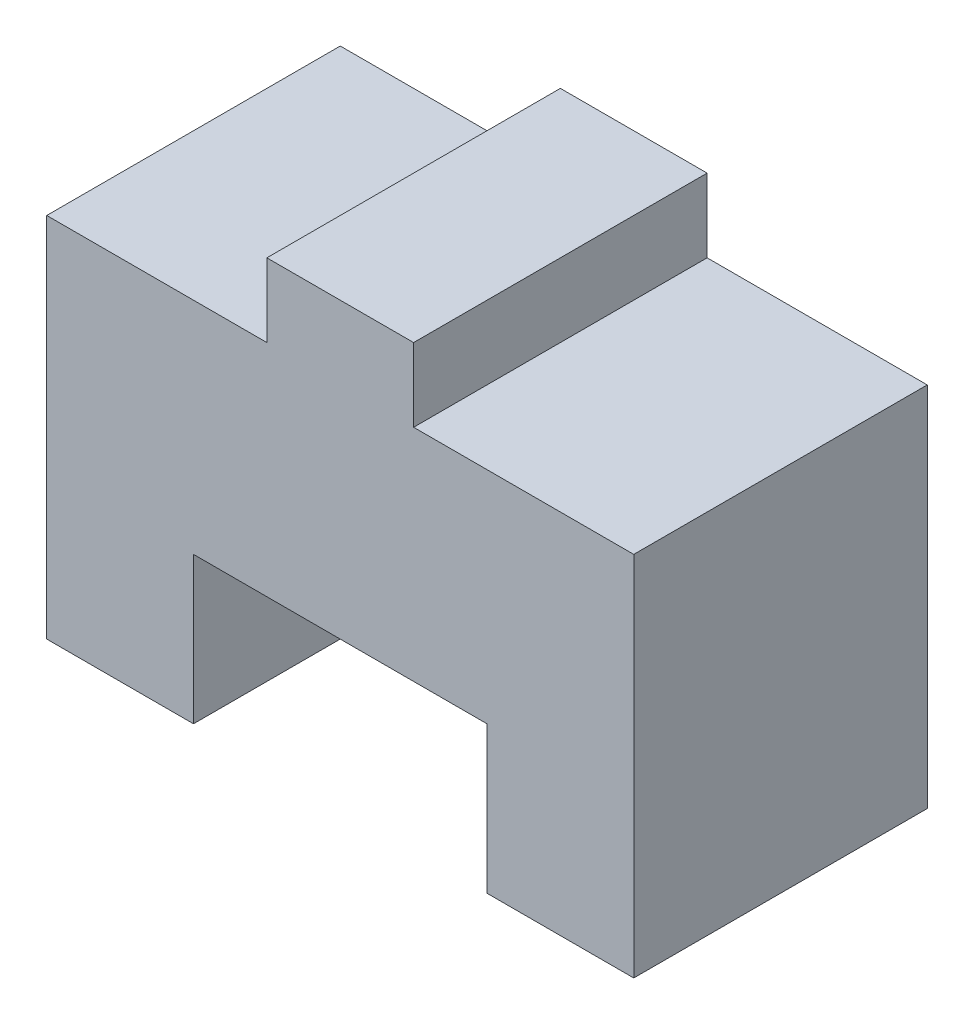
ISO-10303-21;
HEADER;
FILE_DESCRIPTION(('STEP AP214'),'2;1');
FILE_NAME('part.step','',(''),(''),'','','');
FILE_SCHEMA(('AUTOMOTIVE_DESIGN { 1 0 10303 214 1 1 1 1 }'));
ENDSEC;
DATA;
#1=APPLICATION_CONTEXT('core data for automotive mechanical design processes');
#2=APPLICATION_PROTOCOL_DEFINITION('international standard','automotive_design',2000,#1);
#3=PRODUCT_CONTEXT('',#1,'mechanical');
#4=PRODUCT('Part','Part','',(#3));
#5=PRODUCT_RELATED_PRODUCT_CATEGORY('part','',(#4));
#6=PRODUCT_DEFINITION_FORMATION('','',#4);
#7=PRODUCT_DEFINITION_CONTEXT('part definition',#1,'design');
#8=PRODUCT_DEFINITION('design','',#6,#7);
#9=PRODUCT_DEFINITION_SHAPE('','',#8);
#10=(LENGTH_UNIT() NAMED_UNIT(*) SI_UNIT(.MILLI.,.METRE.));
#11=(NAMED_UNIT(*) PLANE_ANGLE_UNIT() SI_UNIT($,.RADIAN.));
#12=(NAMED_UNIT(*) SI_UNIT($,.STERADIAN.) SOLID_ANGLE_UNIT());
#13=UNCERTAINTY_MEASURE_WITH_UNIT(LENGTH_MEASURE(1.E-05),#10,'distance_accuracy_value','');
#14=(GEOMETRIC_REPRESENTATION_CONTEXT(3) GLOBAL_UNCERTAINTY_ASSIGNED_CONTEXT((#13)) GLOBAL_UNIT_ASSIGNED_CONTEXT((#10,
#11,#12)) REPRESENTATION_CONTEXT('',''));
#15=CARTESIAN_POINT('',(0.,0.,0.));
#16=DIRECTION('',(0.,0.,1.));
#17=DIRECTION('',(1.,0.,0.));
#18=AXIS2_PLACEMENT_3D('',#15,#16,#17);
#19=CARTESIAN_POINT('',(0.,25.,20.));
#20=DIRECTION('',(1.,0.,0.));
#21=DIRECTION('',(0.,1.,0.));
#22=AXIS2_PLACEMENT_3D('',#19,#20,#21);
#23=PLANE('',#22);
#24=DIRECTION('',(0.,-1.,0.));
#25=VECTOR('',#24,1.);
#26=CARTESIAN_POINT('',(0.,25.,0.));
#27=LINE('',#26,#25);
#28=CARTESIAN_POINT('',(0.,25.,0.));
#29=VERTEX_POINT('',#28);
#30=CARTESIAN_POINT('',(0.,0.,0.));
#31=VERTEX_POINT('',#30);
#32=EDGE_CURVE('E153',#29,#31,#27,.T.);
#33=ORIENTED_EDGE('',*,*,#32,.T.);
#34=DIRECTION('',(0.,0.,-1.));
#35=VECTOR('',#34,1.);
#36=CARTESIAN_POINT('',(0.,0.,20.));
#37=LINE('',#36,#35);
#38=CARTESIAN_POINT('',(0.,0.,20.));
#39=VERTEX_POINT('',#38);
#40=EDGE_CURVE('E11',#39,#31,#37,.T.);
#41=ORIENTED_EDGE('',*,*,#40,.F.);
#42=DIRECTION('',(0.,-1.,0.));
#43=VECTOR('',#42,1.);
#44=CARTESIAN_POINT('',(0.,25.,20.));
#45=LINE('',#44,#43);
#46=CARTESIAN_POINT('',(0.,25.,20.));
#47=VERTEX_POINT('',#46);
#48=EDGE_CURVE('E175',#47,#39,#45,.T.);
#49=ORIENTED_EDGE('',*,*,#48,.F.);
#50=DIRECTION('',(0.,0.,-1.));
#51=VECTOR('',#50,1.);
#52=CARTESIAN_POINT('',(0.,25.,20.));
#53=LINE('',#52,#51);
#54=EDGE_CURVE('E149',#47,#29,#53,.T.);
#55=ORIENTED_EDGE('',*,*,#54,.T.);
#56=EDGE_LOOP('',(#33,#41,#49,#55));
#57=FACE_BOUND('',#56,.T.);
#58=ADVANCED_FACE('F33',(#57),#23,.F.);
#59=CARTESIAN_POINT('',(0.,0.,20.));
#60=DIRECTION('',(0.,1.,0.));
#61=DIRECTION('',(0.,0.,1.));
#62=AXIS2_PLACEMENT_3D('',#59,#60,#61);
#63=PLANE('',#62);
#64=DIRECTION('',(1.,0.,0.));
#65=VECTOR('',#64,1.);
#66=CARTESIAN_POINT('',(0.,0.,0.));
#67=LINE('',#66,#65);
#68=CARTESIAN_POINT('',(10.,0.,0.));
#69=VERTEX_POINT('',#68);
#70=EDGE_CURVE('E156',#31,#69,#67,.T.);
#71=ORIENTED_EDGE('',*,*,#70,.T.);
#72=DIRECTION('',(0.,0.,-1.));
#73=VECTOR('',#72,1.);
#74=CARTESIAN_POINT('',(10.,0.,20.));
#75=LINE('',#74,#73);
#76=CARTESIAN_POINT('',(10.,0.,20.));
#77=VERTEX_POINT('',#76);
#78=EDGE_CURVE('E41',#77,#69,#75,.T.);
#79=ORIENTED_EDGE('',*,*,#78,.F.);
#80=DIRECTION('',(1.,0.,0.));
#81=VECTOR('',#80,1.);
#82=CARTESIAN_POINT('',(0.,0.,20.));
#83=LINE('',#82,#81);
#84=EDGE_CURVE('E104',#39,#77,#83,.T.);
#85=ORIENTED_EDGE('',*,*,#84,.F.);
#86=ORIENTED_EDGE('',*,*,#40,.T.);
#87=EDGE_LOOP('',(#71,#79,#85,#86));
#88=FACE_BOUND('',#87,.T.);
#89=ADVANCED_FACE('F253',(#88),#63,.F.);
#90=CARTESIAN_POINT('',(10.,0.,20.));
#91=DIRECTION('',(-1.,0.,0.));
#92=DIRECTION('',(0.,0.,1.));
#93=AXIS2_PLACEMENT_3D('',#90,#91,#92);
#94=PLANE('',#93);
#95=DIRECTION('',(0.,1.,0.));
#96=VECTOR('',#95,1.);
#97=CARTESIAN_POINT('',(10.,0.,0.));
#98=LINE('',#97,#96);
#99=CARTESIAN_POINT('',(10.,10.,0.));
#100=VERTEX_POINT('',#99);
#101=EDGE_CURVE('E158',#69,#100,#98,.T.);
#102=ORIENTED_EDGE('',*,*,#101,.T.);
#103=DIRECTION('',(0.,0.,-1.));
#104=VECTOR('',#103,1.);
#105=CARTESIAN_POINT('',(10.,10.,20.));
#106=LINE('',#105,#104);
#107=CARTESIAN_POINT('',(10.,10.,20.));
#108=VERTEX_POINT('',#107);
#109=EDGE_CURVE('E194',#108,#100,#106,.T.);
#110=ORIENTED_EDGE('',*,*,#109,.F.);
#111=DIRECTION('',(0.,1.,0.));
#112=VECTOR('',#111,1.);
#113=CARTESIAN_POINT('',(10.,0.,20.));
#114=LINE('',#113,#112);
#115=EDGE_CURVE('E202',#77,#108,#114,.T.);
#116=ORIENTED_EDGE('',*,*,#115,.F.);
#117=ORIENTED_EDGE('',*,*,#78,.T.);
#118=EDGE_LOOP('',(#102,#110,#116,#117));
#119=FACE_BOUND('',#118,.T.);
#120=ADVANCED_FACE('F200',(#119),#94,.F.);
#121=CARTESIAN_POINT('',(10.,10.,20.));
#122=DIRECTION('',(0.,1.,0.));
#123=DIRECTION('',(0.,0.,1.));
#124=AXIS2_PLACEMENT_3D('',#121,#122,#123);
#125=PLANE('',#124);
#126=DIRECTION('',(1.,0.,0.));
#127=VECTOR('',#126,1.);
#128=CARTESIAN_POINT('',(10.,10.,0.));
#129=LINE('',#128,#127);
#130=CARTESIAN_POINT('',(30.,10.,0.));
#131=VERTEX_POINT('',#130);
#132=EDGE_CURVE('E160',#100,#131,#129,.T.);
#133=ORIENTED_EDGE('',*,*,#132,.T.);
#134=DIRECTION('',(0.,0.,-1.));
#135=VECTOR('',#134,1.);
#136=CARTESIAN_POINT('',(30.,10.,20.));
#137=LINE('',#136,#135);
#138=CARTESIAN_POINT('',(30.,10.,20.));
#139=VERTEX_POINT('',#138);
#140=EDGE_CURVE('E191',#139,#131,#137,.T.);
#141=ORIENTED_EDGE('',*,*,#140,.F.);
#142=DIRECTION('',(1.,0.,0.));
#143=VECTOR('',#142,1.);
#144=CARTESIAN_POINT('',(10.,10.,20.));
#145=LINE('',#144,#143);
#146=EDGE_CURVE('E220',#108,#139,#145,.T.);
#147=ORIENTED_EDGE('',*,*,#146,.F.);
#148=ORIENTED_EDGE('',*,*,#109,.T.);
#149=EDGE_LOOP('',(#133,#141,#147,#148));
#150=FACE_BOUND('',#149,.T.);
#151=ADVANCED_FACE('F211',(#150),#125,.F.);
#152=CARTESIAN_POINT('',(30.,10.,20.));
#153=DIRECTION('',(1.,0.,0.));
#154=DIRECTION('',(0.,0.,-1.));
#155=AXIS2_PLACEMENT_3D('',#152,#153,#154);
#156=PLANE('',#155);
#157=DIRECTION('',(0.,-1.,0.));
#158=VECTOR('',#157,1.);
#159=CARTESIAN_POINT('',(30.,10.,0.));
#160=LINE('',#159,#158);
#161=CARTESIAN_POINT('',(30.,0.,0.));
#162=VERTEX_POINT('',#161);
#163=EDGE_CURVE('E162',#131,#162,#160,.T.);
#164=ORIENTED_EDGE('',*,*,#163,.T.);
#165=DIRECTION('',(0.,0.,-1.));
#166=VECTOR('',#165,1.);
#167=CARTESIAN_POINT('',(30.,0.,20.));
#168=LINE('',#167,#166);
#169=CARTESIAN_POINT('',(30.,0.,20.));
#170=VERTEX_POINT('',#169);
#171=EDGE_CURVE('E188',#170,#162,#168,.T.);
#172=ORIENTED_EDGE('',*,*,#171,.F.);
#173=DIRECTION('',(0.,-1.,0.));
#174=VECTOR('',#173,1.);
#175=CARTESIAN_POINT('',(30.,10.,20.));
#176=LINE('',#175,#174);
#177=EDGE_CURVE('E217',#139,#170,#176,.T.);
#178=ORIENTED_EDGE('',*,*,#177,.F.);
#179=ORIENTED_EDGE('',*,*,#140,.T.);
#180=EDGE_LOOP('',(#164,#172,#178,#179));
#181=FACE_BOUND('',#180,.T.);
#182=ADVANCED_FACE('F215',(#181),#156,.F.);
#183=CARTESIAN_POINT('',(30.,0.,20.));
#184=DIRECTION('',(0.,1.,0.));
#185=DIRECTION('',(0.,0.,1.));
#186=AXIS2_PLACEMENT_3D('',#183,#184,#185);
#187=PLANE('',#186);
#188=DIRECTION('',(1.,0.,0.));
#189=VECTOR('',#188,1.);
#190=CARTESIAN_POINT('',(30.,0.,0.));
#191=LINE('',#190,#189);
#192=CARTESIAN_POINT('',(40.,0.,0.));
#193=VERTEX_POINT('',#192);
#194=EDGE_CURVE('E164',#162,#193,#191,.T.);
#195=ORIENTED_EDGE('',*,*,#194,.T.);
#196=DIRECTION('',(0.,0.,-1.));
#197=VECTOR('',#196,1.);
#198=CARTESIAN_POINT('',(40.,0.,20.));
#199=LINE('',#198,#197);
#200=CARTESIAN_POINT('',(40.,0.,20.));
#201=VERTEX_POINT('',#200);
#202=EDGE_CURVE('E185',#201,#193,#199,.T.);
#203=ORIENTED_EDGE('',*,*,#202,.F.);
#204=DIRECTION('',(1.,0.,0.));
#205=VECTOR('',#204,1.);
#206=CARTESIAN_POINT('',(30.,0.,20.));
#207=LINE('',#206,#205);
#208=EDGE_CURVE('E219',#170,#201,#207,.T.);
#209=ORIENTED_EDGE('',*,*,#208,.F.);
#210=ORIENTED_EDGE('',*,*,#171,.T.);
#211=EDGE_LOOP('',(#195,#203,#209,#210));
#212=FACE_BOUND('',#211,.T.);
#213=ADVANCED_FACE('F266',(#212),#187,.F.);
#214=CARTESIAN_POINT('',(40.,0.,20.));
#215=DIRECTION('',(-1.,0.,0.));
#216=DIRECTION('',(0.,0.,1.));
#217=AXIS2_PLACEMENT_3D('',#214,#215,#216);
#218=PLANE('',#217);
#219=DIRECTION('',(0.,1.,0.));
#220=VECTOR('',#219,1.);
#221=CARTESIAN_POINT('',(40.,0.,0.));
#222=LINE('',#221,#220);
#223=CARTESIAN_POINT('',(40.,25.,0.));
#224=VERTEX_POINT('',#223);
#225=EDGE_CURVE('E166',#193,#224,#222,.T.);
#226=ORIENTED_EDGE('',*,*,#225,.T.);
#227=DIRECTION('',(0.,0.,-1.));
#228=VECTOR('',#227,1.);
#229=CARTESIAN_POINT('',(40.,25.,20.));
#230=LINE('',#229,#228);
#231=CARTESIAN_POINT('',(40.,25.,20.));
#232=VERTEX_POINT('',#231);
#233=EDGE_CURVE('E182',#232,#224,#230,.T.);
#234=ORIENTED_EDGE('',*,*,#233,.F.);
#235=DIRECTION('',(0.,1.,0.));
#236=VECTOR('',#235,1.);
#237=CARTESIAN_POINT('',(40.,0.,20.));
#238=LINE('',#237,#236);
#239=EDGE_CURVE('E222',#201,#232,#238,.T.);
#240=ORIENTED_EDGE('',*,*,#239,.F.);
#241=ORIENTED_EDGE('',*,*,#202,.T.);
#242=EDGE_LOOP('',(#226,#234,#240,#241));
#243=FACE_BOUND('',#242,.T.);
#244=ADVANCED_FACE('F269',(#243),#218,.F.);
#245=CARTESIAN_POINT('',(40.,25.,20.));
#246=DIRECTION('',(0.,-1.,0.));
#247=DIRECTION('',(1.,0.,0.));
#248=AXIS2_PLACEMENT_3D('',#245,#246,#247);
#249=PLANE('',#248);
#250=DIRECTION('',(-1.,0.,0.));
#251=VECTOR('',#250,1.);
#252=CARTESIAN_POINT('',(40.,25.,0.));
#253=LINE('',#252,#251);
#254=CARTESIAN_POINT('',(25.,25.,0.));
#255=VERTEX_POINT('',#254);
#256=EDGE_CURVE('E168',#224,#255,#253,.T.);
#257=ORIENTED_EDGE('',*,*,#256,.T.);
#258=DIRECTION('',(0.,0.,-1.));
#259=VECTOR('',#258,1.);
#260=CARTESIAN_POINT('',(25.,25.,20.));
#261=LINE('',#260,#259);
#262=CARTESIAN_POINT('',(25.,25.,20.));
#263=VERTEX_POINT('',#262);
#264=EDGE_CURVE('E179',#263,#255,#261,.T.);
#265=ORIENTED_EDGE('',*,*,#264,.F.);
#266=DIRECTION('',(-1.,0.,0.));
#267=VECTOR('',#266,1.);
#268=CARTESIAN_POINT('',(40.,25.,20.));
#269=LINE('',#268,#267);
#270=EDGE_CURVE('E228',#232,#263,#269,.T.);
#271=ORIENTED_EDGE('',*,*,#270,.F.);
#272=ORIENTED_EDGE('',*,*,#233,.T.);
#273=EDGE_LOOP('',(#257,#265,#271,#272));
#274=FACE_BOUND('',#273,.T.);
#275=ADVANCED_FACE('F234',(#274),#249,.F.);
#276=CARTESIAN_POINT('',(25.,25.,20.));
#277=DIRECTION('',(-1.,0.,0.));
#278=DIRECTION('',(0.,0.,1.));
#279=AXIS2_PLACEMENT_3D('',#276,#277,#278);
#280=PLANE('',#279);
#281=DIRECTION('',(0.,1.,0.));
#282=VECTOR('',#281,1.);
#283=CARTESIAN_POINT('',(25.,25.,0.));
#284=LINE('',#283,#282);
#285=CARTESIAN_POINT('',(25.,30.,0.));
#286=VERTEX_POINT('',#285);
#287=EDGE_CURVE('E170',#255,#286,#284,.T.);
#288=ORIENTED_EDGE('',*,*,#287,.T.);
#289=DIRECTION('',(0.,0.,-1.));
#290=VECTOR('',#289,1.);
#291=CARTESIAN_POINT('',(25.,30.,20.));
#292=LINE('',#291,#290);
#293=CARTESIAN_POINT('',(25.,30.,20.));
#294=VERTEX_POINT('',#293);
#295=EDGE_CURVE('E144',#294,#286,#292,.T.);
#296=ORIENTED_EDGE('',*,*,#295,.F.);
#297=DIRECTION('',(0.,1.,0.));
#298=VECTOR('',#297,1.);
#299=CARTESIAN_POINT('',(25.,25.,20.));
#300=LINE('',#299,#298);
#301=EDGE_CURVE('E135',#263,#294,#300,.T.);
#302=ORIENTED_EDGE('',*,*,#301,.F.);
#303=ORIENTED_EDGE('',*,*,#264,.T.);
#304=EDGE_LOOP('',(#288,#296,#302,#303));
#305=FACE_BOUND('',#304,.T.);
#306=ADVANCED_FACE('F238',(#305),#280,.F.);
#307=CARTESIAN_POINT('',(25.,30.,20.));
#308=DIRECTION('',(0.,-1.,0.));
#309=DIRECTION('',(1.,0.,0.));
#310=AXIS2_PLACEMENT_3D('',#307,#308,#309);
#311=PLANE('',#310);
#312=DIRECTION('',(-1.,0.,0.));
#313=VECTOR('',#312,1.);
#314=CARTESIAN_POINT('',(25.,30.,0.));
#315=LINE('',#314,#313);
#316=CARTESIAN_POINT('',(15.,30.,0.));
#317=VERTEX_POINT('',#316);
#318=EDGE_CURVE('E143',#286,#317,#315,.T.);
#319=ORIENTED_EDGE('',*,*,#318,.T.);
#320=DIRECTION('',(0.,0.,-1.));
#321=VECTOR('',#320,1.);
#322=CARTESIAN_POINT('',(15.,30.,20.));
#323=LINE('',#322,#321);
#324=CARTESIAN_POINT('',(15.,30.,20.));
#325=VERTEX_POINT('',#324);
#326=EDGE_CURVE('E140',#325,#317,#323,.T.);
#327=ORIENTED_EDGE('',*,*,#326,.F.);
#328=DIRECTION('',(-1.,0.,0.));
#329=VECTOR('',#328,1.);
#330=CARTESIAN_POINT('',(25.,30.,20.));
#331=LINE('',#330,#329);
#332=EDGE_CURVE('E129',#294,#325,#331,.T.);
#333=ORIENTED_EDGE('',*,*,#332,.F.);
#334=ORIENTED_EDGE('',*,*,#295,.T.);
#335=EDGE_LOOP('',(#319,#327,#333,#334));
#336=FACE_BOUND('',#335,.T.);
#337=ADVANCED_FACE('F141',(#336),#311,.F.);
#338=CARTESIAN_POINT('',(15.,30.,20.));
#339=DIRECTION('',(1.,0.,0.));
#340=DIRECTION('',(0.,1.,0.));
#341=AXIS2_PLACEMENT_3D('',#338,#339,#340);
#342=PLANE('',#341);
#343=DIRECTION('',(0.,-1.,0.));
#344=VECTOR('',#343,1.);
#345=CARTESIAN_POINT('',(15.,30.,0.));
#346=LINE('',#345,#344);
#347=CARTESIAN_POINT('',(15.,25.,0.));
#348=VERTEX_POINT('',#347);
#349=EDGE_CURVE('E90',#317,#348,#346,.T.);
#350=ORIENTED_EDGE('',*,*,#349,.T.);
#351=DIRECTION('',(0.,0.,-1.));
#352=VECTOR('',#351,1.);
#353=CARTESIAN_POINT('',(15.,25.,20.));
#354=LINE('',#353,#352);
#355=CARTESIAN_POINT('',(15.,25.,20.));
#356=VERTEX_POINT('',#355);
#357=EDGE_CURVE('E145',#356,#348,#354,.T.);
#358=ORIENTED_EDGE('',*,*,#357,.F.);
#359=DIRECTION('',(0.,-1.,0.));
#360=VECTOR('',#359,1.);
#361=CARTESIAN_POINT('',(15.,30.,20.));
#362=LINE('',#361,#360);
#363=EDGE_CURVE('E133',#325,#356,#362,.T.);
#364=ORIENTED_EDGE('',*,*,#363,.F.);
#365=ORIENTED_EDGE('',*,*,#326,.T.);
#366=EDGE_LOOP('',(#350,#358,#364,#365));
#367=FACE_BOUND('',#366,.T.);
#368=ADVANCED_FACE('F147',(#367),#342,.F.);
#369=CARTESIAN_POINT('',(15.,25.,20.));
#370=DIRECTION('',(0.,-1.,0.));
#371=DIRECTION('',(0.,0.,-1.));
#372=AXIS2_PLACEMENT_3D('',#369,#370,#371);
#373=PLANE('',#372);
#374=DIRECTION('',(-1.,0.,0.));
#375=VECTOR('',#374,1.);
#376=CARTESIAN_POINT('',(15.,25.,0.));
#377=LINE('',#376,#375);
#378=EDGE_CURVE('E96',#348,#29,#377,.T.);
#379=ORIENTED_EDGE('',*,*,#378,.T.);
#380=ORIENTED_EDGE('',*,*,#54,.F.);
#381=DIRECTION('',(-1.,0.,0.));
#382=VECTOR('',#381,1.);
#383=CARTESIAN_POINT('',(15.,25.,20.));
#384=LINE('',#383,#382);
#385=EDGE_CURVE('E49',#356,#47,#384,.T.);
#386=ORIENTED_EDGE('',*,*,#385,.F.);
#387=ORIENTED_EDGE('',*,*,#357,.T.);
#388=EDGE_LOOP('',(#379,#380,#386,#387));
#389=FACE_BOUND('',#388,.T.);
#390=ADVANCED_FACE('F242',(#389),#373,.F.);
#391=CARTESIAN_POINT('',(0.,0.,20.));
#392=DIRECTION('',(0.,0.,1.));
#393=DIRECTION('',(1.,0.,0.));
#394=AXIS2_PLACEMENT_3D('',#391,#392,#393);
#395=PLANE('',#394);
#396=ORIENTED_EDGE('',*,*,#48,.T.);
#397=ORIENTED_EDGE('',*,*,#84,.T.);
#398=ORIENTED_EDGE('',*,*,#115,.T.);
#399=ORIENTED_EDGE('',*,*,#146,.T.);
#400=ORIENTED_EDGE('',*,*,#177,.T.);
#401=ORIENTED_EDGE('',*,*,#208,.T.);
#402=ORIENTED_EDGE('',*,*,#239,.T.);
#403=ORIENTED_EDGE('',*,*,#270,.T.);
#404=ORIENTED_EDGE('',*,*,#301,.T.);
#405=ORIENTED_EDGE('',*,*,#332,.T.);
#406=ORIENTED_EDGE('',*,*,#363,.T.);
#407=ORIENTED_EDGE('',*,*,#385,.T.);
#408=EDGE_LOOP('',(#396,#397,#398,#399,#400,#401,#402,#403,#404,#405,#406,#407));
#409=FACE_BOUND('',#408,.T.);
#410=ADVANCED_FACE('F131',(#409),#395,.T.);
#411=CARTESIAN_POINT('',(0.,0.,0.));
#412=DIRECTION('',(0.,0.,1.));
#413=DIRECTION('',(1.,0.,0.));
#414=AXIS2_PLACEMENT_3D('',#411,#412,#413);
#415=PLANE('',#414);
#416=ORIENTED_EDGE('',*,*,#32,.F.);
#417=ORIENTED_EDGE('',*,*,#378,.F.);
#418=ORIENTED_EDGE('',*,*,#349,.F.);
#419=ORIENTED_EDGE('',*,*,#318,.F.);
#420=ORIENTED_EDGE('',*,*,#287,.F.);
#421=ORIENTED_EDGE('',*,*,#256,.F.);
#422=ORIENTED_EDGE('',*,*,#225,.F.);
#423=ORIENTED_EDGE('',*,*,#194,.F.);
#424=ORIENTED_EDGE('',*,*,#163,.F.);
#425=ORIENTED_EDGE('',*,*,#132,.F.);
#426=ORIENTED_EDGE('',*,*,#101,.F.);
#427=ORIENTED_EDGE('',*,*,#70,.F.);
#428=EDGE_LOOP('',(#416,#417,#418,#419,#420,#421,#422,#423,#424,#425,#426,#427));
#429=FACE_BOUND('',#428,.T.);
#430=ADVANCED_FACE('F206',(#429),#415,.F.);
#431=CLOSED_SHELL('',(#58,#89,#120,#151,#182,#213,#244,#275,#306,#337,#368,#390,#410,#430));
#432=MANIFOLD_SOLID_BREP('B2',#431);
#433=ADVANCED_BREP_SHAPE_REPRESENTATION('',(#18,#432),#14);
#434=SHAPE_DEFINITION_REPRESENTATION(#9,#433);
ENDSEC;
END-ISO-10303-21;
